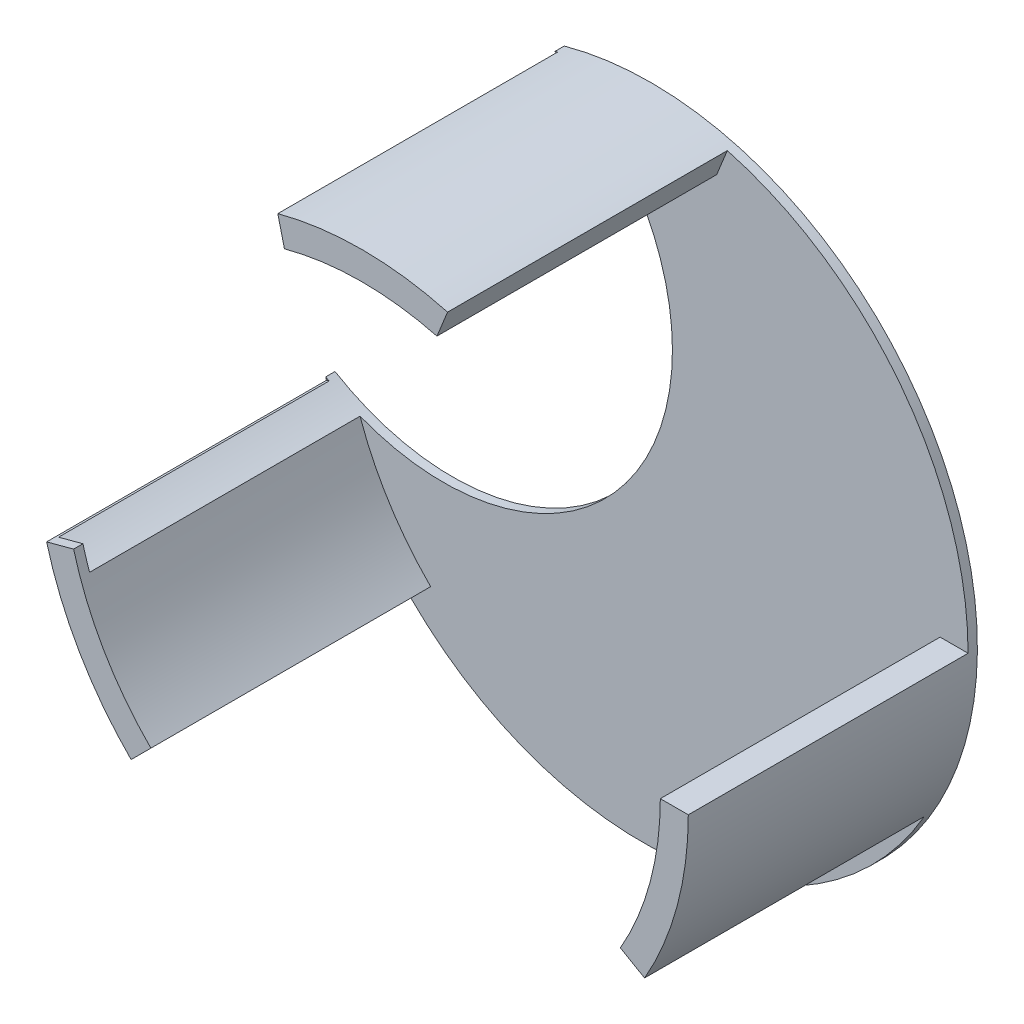
ISO-10303-21;
HEADER;
FILE_DESCRIPTION(('STEP AP214'),'2;1');
FILE_NAME('part.step','',(''),(''),'','','');
FILE_SCHEMA(('AUTOMOTIVE_DESIGN { 1 0 10303 214 1 1 1 1 }'));
ENDSEC;
DATA;
#1=APPLICATION_CONTEXT('core data for automotive mechanical design processes');
#2=APPLICATION_PROTOCOL_DEFINITION('international standard','automotive_design',2000,#1);
#3=PRODUCT_CONTEXT('',#1,'mechanical');
#4=PRODUCT('Part','Part','',(#3));
#5=PRODUCT_RELATED_PRODUCT_CATEGORY('part','',(#4));
#6=PRODUCT_DEFINITION_FORMATION('','',#4);
#7=PRODUCT_DEFINITION_CONTEXT('part definition',#1,'design');
#8=PRODUCT_DEFINITION('design','',#6,#7);
#9=PRODUCT_DEFINITION_SHAPE('','',#8);
#10=(LENGTH_UNIT() NAMED_UNIT(*) SI_UNIT(.MILLI.,.METRE.));
#11=(NAMED_UNIT(*) PLANE_ANGLE_UNIT() SI_UNIT($,.RADIAN.));
#12=(NAMED_UNIT(*) SI_UNIT($,.STERADIAN.) SOLID_ANGLE_UNIT());
#13=UNCERTAINTY_MEASURE_WITH_UNIT(LENGTH_MEASURE(1.E-05),#10,'distance_accuracy_value','');
#14=(GEOMETRIC_REPRESENTATION_CONTEXT(3) GLOBAL_UNCERTAINTY_ASSIGNED_CONTEXT((#13)) GLOBAL_UNIT_ASSIGNED_CONTEXT((#10,
#11,#12)) REPRESENTATION_CONTEXT('',''));
#15=CARTESIAN_POINT('',(0.,0.,0.));
#16=DIRECTION('',(0.,0.,1.));
#17=DIRECTION('',(1.,0.,0.));
#18=AXIS2_PLACEMENT_3D('',#15,#16,#17);
#19=CARTESIAN_POINT('',(0.,0.,0.5));
#20=DIRECTION('',(0.,0.,1.));
#21=DIRECTION('',(1.,0.,0.));
#22=AXIS2_PLACEMENT_3D('',#19,#20,#21);
#23=PLANE('',#22);
#24=CARTESIAN_POINT('',(-10.6304427894422,6.14635915775715,0.5));
#25=DIRECTION('',(0.,0.,1.));
#26=DIRECTION('',(1.,0.,0.));
#27=AXIS2_PLACEMENT_3D('',#24,#25,#26);
#28=CIRCLE('',#27,12.279415490802);
#29=CARTESIAN_POINT('',(-4.47445203521553,16.7712272806858,0.5));
#30=VERTEX_POINT('',#29);
#31=CARTESIAN_POINT('',(-4.64986435659355,16.8709442967867,0.5));
#32=VERTEX_POINT('',#31);
#33=EDGE_CURVE('E189',#30,#32,#28,.T.);
#34=ORIENTED_EDGE('',*,*,#33,.F.);
#35=DIRECTION('',(0.237212223602337,-0.971457853421153,0.));
#36=VECTOR('',#35,1.);
#37=CARTESIAN_POINT('',(-0.357886485286954,-0.0873893279807982,0.5));
#38=LINE('',#37,#36);
#39=CARTESIAN_POINT('',(-4.50818045766763,16.9093556636882,0.5));
#40=VERTEX_POINT('',#39);
#41=EDGE_CURVE('E188',#40,#30,#38,.T.);
#42=ORIENTED_EDGE('',*,*,#41,.F.);
#43=CARTESIAN_POINT('',(0.,0.,0.5));
#44=DIRECTION('',(0.,0.,1.));
#45=DIRECTION('',(1.,0.,0.));
#46=AXIS2_PLACEMENT_3D('',#43,#44,#45);
#47=CIRCLE('',#46,17.5);
#48=EDGE_CURVE('E292',#40,#32,#47,.T.);
#49=ORIENTED_EDGE('',*,*,#48,.T.);
#50=EDGE_LOOP('',(#34,#42,#49));
#51=FACE_BOUND('',#50,.T.);
#52=ADVANCED_FACE('F35',(#51),#23,.T.);
#53=CARTESIAN_POINT('',(-16.9411011111166,-4.38737884652367,0.5));
#54=VERTEX_POINT('',#53);
#55=CARTESIAN_POINT('',(-16.763496719694,-4.49176540836688,0.5));
#56=VERTEX_POINT('',#55);
#57=EDGE_CURVE('E194',#54,#56,#28,.T.);
#58=ORIENTED_EDGE('',*,*,#57,.F.);
#59=CARTESIAN_POINT('',(-16.9037019600579,-4.52933328929702,0.5));
#60=VERTEX_POINT('',#59);
#61=EDGE_CURVE('E39',#54,#60,#47,.T.);
#62=ORIENTED_EDGE('',*,*,#61,.T.);
#63=DIRECTION('',(0.965925826289024,0.258819045102686,0.));
#64=VECTOR('',#63,1.);
#65=CARTESIAN_POINT('',(-16.9037019600579,-4.52933328929702,0.5));
#66=LINE('',#65,#64);
#67=EDGE_CURVE('E218',#60,#56,#66,.T.);
#68=ORIENTED_EDGE('',*,*,#67,.T.);
#69=EDGE_LOOP('',(#58,#62,#68));
#70=FACE_BOUND('',#69,.T.);
#71=ADVANCED_FACE('F335',(#70),#23,.T.);
#72=CARTESIAN_POINT('',(-15.0999283417228,-5.29076214498786,0.5));
#73=VERTEX_POINT('',#72);
#74=CARTESIAN_POINT('',(-2.94873013869004,15.7263036015952,0.5));
#75=VERTEX_POINT('',#74);
#76=EDGE_CURVE('E174',#73,#75,#28,.T.);
#77=ORIENTED_EDGE('',*,*,#76,.F.);
#78=CARTESIAN_POINT('',(0.,0.,0.5));
#79=DIRECTION('',(0.,0.,1.));
#80=DIRECTION('',(1.,0.,0.));
#81=AXIS2_PLACEMENT_3D('',#78,#79,#80);
#82=CIRCLE('',#81,16.);
#83=CARTESIAN_POINT('',(-11.3137084989848,-11.3137084989847,0.5));
#84=VERTEX_POINT('',#83);
#85=EDGE_CURVE('E60',#73,#84,#82,.T.);
#86=ORIENTED_EDGE('',*,*,#85,.T.);
#87=DIRECTION('',(0.707106781186551,0.707106781186545,0.));
#88=VECTOR('',#87,1.);
#89=CARTESIAN_POINT('',(-12.3743686707647,-12.3743686707645,0.5));
#90=LINE('',#89,#88);
#91=CARTESIAN_POINT('',(-12.3743686707647,-12.3743686707645,0.5));
#92=VERTEX_POINT('',#91);
#93=EDGE_CURVE('E213',#92,#84,#90,.T.);
#94=ORIENTED_EDGE('',*,*,#93,.F.);
#95=CARTESIAN_POINT('',(15.1554445662277,-8.75000000000002,0.5));
#96=VERTEX_POINT('',#95);
#97=EDGE_CURVE('E296',#92,#96,#47,.T.);
#98=ORIENTED_EDGE('',*,*,#97,.T.);
#99=DIRECTION('',(0.866025403784432,-0.500000000000012,0.));
#100=VECTOR('',#99,1.);
#101=CARTESIAN_POINT('',(1.09721259855536E-13,1.90042796740249E-13,0.5));
#102=LINE('',#101,#100);
#103=CARTESIAN_POINT('',(13.856406460551,-8.,0.5));
#104=VERTEX_POINT('',#103);
#105=EDGE_CURVE('E269',#104,#96,#102,.T.);
#106=ORIENTED_EDGE('',*,*,#105,.F.);
#107=CARTESIAN_POINT('',(0.,0.,0.5));
#108=DIRECTION('',(0.,0.,1.));
#109=DIRECTION('',(1.,0.,0.));
#110=AXIS2_PLACEMENT_3D('',#107,#108,#109);
#111=CIRCLE('',#110,16.);
#112=CARTESIAN_POINT('',(16.,0.,0.5));
#113=VERTEX_POINT('',#112);
#114=EDGE_CURVE('E248',#104,#113,#111,.T.);
#115=ORIENTED_EDGE('',*,*,#114,.T.);
#116=DIRECTION('',(1.,0.,0.));
#117=VECTOR('',#116,1.);
#118=CARTESIAN_POINT('',(0.,0.,0.5));
#119=LINE('',#118,#117);
#120=CARTESIAN_POINT('',(17.5,0.,0.5));
#121=VERTEX_POINT('',#120);
#122=EDGE_CURVE('E260',#113,#121,#119,.T.);
#123=ORIENTED_EDGE('',*,*,#122,.T.);
#124=CARTESIAN_POINT('',(4.59298212333175,16.8865187417287,0.5));
#125=VERTEX_POINT('',#124);
#126=EDGE_CURVE('E295',#121,#125,#47,.T.);
#127=ORIENTED_EDGE('',*,*,#126,.T.);
#128=DIRECTION('',(0.376927889119517,0.926242606666258,0.));
#129=VECTOR('',#128,1.);
#130=CARTESIAN_POINT('',(-1.95509819432033,0.795613406361118,0.5));
#131=LINE('',#130,#129);
#132=CARTESIAN_POINT('',(4.02317567540056,15.4863065927686,0.5));
#133=VERTEX_POINT('',#132);
#134=EDGE_CURVE('E241',#133,#125,#131,.T.);
#135=ORIENTED_EDGE('',*,*,#134,.F.);
#136=CARTESIAN_POINT('',(0.,0.,0.5));
#137=DIRECTION('',(0.,0.,1.));
#138=DIRECTION('',(1.,0.,0.));
#139=AXIS2_PLACEMENT_3D('',#136,#137,#138);
#140=CIRCLE('',#139,16.0003635708806);
#141=EDGE_CURVE('E244',#75,#133,#140,.F.);
#142=ORIENTED_EDGE('',*,*,#141,.F.);
#143=EDGE_LOOP('',(#77,#86,#94,#98,#106,#115,#123,#127,#135,#142));
#144=FACE_BOUND('',#143,.T.);
#145=ADVANCED_FACE('F316',(#144),#23,.T.);
#146=CARTESIAN_POINT('',(0.,0.,0.5));
#147=DIRECTION('',(0.,0.,-1.));
#148=DIRECTION('',(-1.,0.,0.));
#149=AXIS2_PLACEMENT_3D('',#146,#147,#148);
#150=CYLINDRICAL_SURFACE('',#149,17.5);
#151=CARTESIAN_POINT('',(0.,0.,0.));
#152=DIRECTION('',(0.,0.,1.));
#153=DIRECTION('',(1.,0.,0.));
#154=AXIS2_PLACEMENT_3D('',#151,#152,#153);
#155=CIRCLE('',#154,17.5);
#156=CARTESIAN_POINT('',(-16.9411011111166,-4.38737884652367,0.));
#157=VERTEX_POINT('',#156);
#158=CARTESIAN_POINT('',(-4.64986435659355,16.8709442967867,0.));
#159=VERTEX_POINT('',#158);
#160=EDGE_CURVE('E298',#157,#159,#155,.T.);
#161=ORIENTED_EDGE('',*,*,#160,.T.);
#162=DIRECTION('',(0.,0.,-1.));
#163=VECTOR('',#162,1.);
#164=CARTESIAN_POINT('',(-4.64986435659355,16.8709442967867,7.5));
#165=LINE('',#164,#163);
#166=EDGE_CURVE('E192',#159,#32,#165,.F.);
#167=ORIENTED_EDGE('',*,*,#166,.T.);
#168=ORIENTED_EDGE('',*,*,#48,.F.);
#169=DIRECTION('',(0.,0.,-1.));
#170=VECTOR('',#169,1.);
#171=CARTESIAN_POINT('',(-4.50818045766763,16.9093556636882,15.5));
#172=LINE('',#171,#170);
#173=CARTESIAN_POINT('',(-4.50818045766763,16.9093556636882,15.5));
#174=VERTEX_POINT('',#173);
#175=EDGE_CURVE('E238',#174,#40,#172,.T.);
#176=ORIENTED_EDGE('',*,*,#175,.F.);
#177=CARTESIAN_POINT('',(0.,0.,15.5));
#178=DIRECTION('',(0.,0.,1.));
#179=DIRECTION('',(1.,0.,0.));
#180=AXIS2_PLACEMENT_3D('',#177,#178,#179);
#181=CIRCLE('',#180,17.5);
#182=CARTESIAN_POINT('',(4.59298212333175,16.8865187417287,15.5));
#183=VERTEX_POINT('',#182);
#184=EDGE_CURVE('E240',#183,#174,#181,.T.);
#185=ORIENTED_EDGE('',*,*,#184,.F.);
#186=DIRECTION('',(0.,0.,-1.));
#187=VECTOR('',#186,1.);
#188=CARTESIAN_POINT('',(4.59298212333175,16.8865187417287,15.5));
#189=LINE('',#188,#187);
#190=EDGE_CURVE('E235',#183,#125,#189,.T.);
#191=ORIENTED_EDGE('',*,*,#190,.T.);
#192=ORIENTED_EDGE('',*,*,#126,.F.);
#193=DIRECTION('',(0.,0.,-1.));
#194=VECTOR('',#193,1.);
#195=CARTESIAN_POINT('',(17.5,0.,15.5));
#196=LINE('',#195,#194);
#197=CARTESIAN_POINT('',(17.5,0.,15.5));
#198=VERTEX_POINT('',#197);
#199=EDGE_CURVE('E282',#198,#121,#196,.T.);
#200=ORIENTED_EDGE('',*,*,#199,.F.);
#201=CARTESIAN_POINT('',(0.,0.,15.5));
#202=DIRECTION('',(0.,0.,1.));
#203=DIRECTION('',(1.,0.,0.));
#204=AXIS2_PLACEMENT_3D('',#201,#202,#203);
#205=CIRCLE('',#204,17.5);
#206=CARTESIAN_POINT('',(15.1554445662277,-8.75000000000002,15.5));
#207=VERTEX_POINT('',#206);
#208=EDGE_CURVE('E262',#207,#198,#205,.T.);
#209=ORIENTED_EDGE('',*,*,#208,.F.);
#210=DIRECTION('',(0.,0.,-1.));
#211=VECTOR('',#210,1.);
#212=CARTESIAN_POINT('',(15.1554445662277,-8.75000000000002,15.5));
#213=LINE('',#212,#211);
#214=EDGE_CURVE('E278',#207,#96,#213,.T.);
#215=ORIENTED_EDGE('',*,*,#214,.T.);
#216=ORIENTED_EDGE('',*,*,#97,.F.);
#217=DIRECTION('',(0.,0.,-1.));
#218=VECTOR('',#217,1.);
#219=CARTESIAN_POINT('',(-12.3743686707647,-12.3743686707645,15.5));
#220=LINE('',#219,#218);
#221=CARTESIAN_POINT('',(-12.3743686707647,-12.3743686707645,15.5));
#222=VERTEX_POINT('',#221);
#223=EDGE_CURVE('E208',#222,#92,#220,.T.);
#224=ORIENTED_EDGE('',*,*,#223,.F.);
#225=CARTESIAN_POINT('',(0.,0.,15.5));
#226=DIRECTION('',(0.,0.,-1.));
#227=DIRECTION('',(-1.,0.,0.));
#228=AXIS2_PLACEMENT_3D('',#225,#226,#227);
#229=CIRCLE('',#228,17.5);
#230=CARTESIAN_POINT('',(-16.9037019600579,-4.52933328929703,15.5));
#231=VERTEX_POINT('',#230);
#232=EDGE_CURVE('E205',#222,#231,#229,.T.);
#233=ORIENTED_EDGE('',*,*,#232,.T.);
#234=DIRECTION('',(0.,0.,-1.));
#235=VECTOR('',#234,1.);
#236=CARTESIAN_POINT('',(-16.9037019600579,-4.52933328929703,15.5));
#237=LINE('',#236,#235);
#238=EDGE_CURVE('E201',#231,#60,#237,.T.);
#239=ORIENTED_EDGE('',*,*,#238,.T.);
#240=ORIENTED_EDGE('',*,*,#61,.F.);
#241=DIRECTION('',(0.,0.,-1.));
#242=VECTOR('',#241,1.);
#243=CARTESIAN_POINT('',(-16.9411011111166,-4.38737884652367,7.5));
#244=LINE('',#243,#242);
#245=EDGE_CURVE('E190',#54,#157,#244,.T.);
#246=ORIENTED_EDGE('',*,*,#245,.T.);
#247=EDGE_LOOP('',(#161,#167,#168,#176,#185,#191,#192,#200,#209,#215,#216,#224,#233,#239,#240,#246));
#248=FACE_BOUND('',#247,.T.);
#249=ADVANCED_FACE('F37',(#248),#150,.T.);
#250=CARTESIAN_POINT('',(0.,0.,0.));
#251=DIRECTION('',(0.,0.,1.));
#252=DIRECTION('',(1.,0.,0.));
#253=AXIS2_PLACEMENT_3D('',#250,#251,#252);
#254=PLANE('',#253);
#255=ORIENTED_EDGE('',*,*,#160,.F.);
#256=CARTESIAN_POINT('',(-10.6304427894422,6.14635915775715,0.));
#257=DIRECTION('',(0.,0.,-1.));
#258=DIRECTION('',(-1.,0.,0.));
#259=AXIS2_PLACEMENT_3D('',#256,#257,#258);
#260=CIRCLE('',#259,12.279415490802);
#261=EDGE_CURVE('E357',#159,#157,#260,.T.);
#262=ORIENTED_EDGE('',*,*,#261,.F.);
#263=EDGE_LOOP('',(#255,#262));
#264=FACE_BOUND('',#263,.T.);
#265=ADVANCED_FACE('F347',(#264),#254,.F.);
#266=CARTESIAN_POINT('',(0.,0.,15.5));
#267=DIRECTION('',(0.,0.,-1.));
#268=DIRECTION('',(-1.,0.,0.));
#269=AXIS2_PLACEMENT_3D('',#266,#267,#268);
#270=CYLINDRICAL_SURFACE('',#269,16.);
#271=ORIENTED_EDGE('',*,*,#114,.F.);
#272=DIRECTION('',(0.,0.,-1.));
#273=VECTOR('',#272,1.);
#274=CARTESIAN_POINT('',(13.856406460551,-8.,15.5));
#275=LINE('',#274,#273);
#276=CARTESIAN_POINT('',(13.856406460551,-8.,15.5));
#277=VERTEX_POINT('',#276);
#278=EDGE_CURVE('E281',#277,#104,#275,.T.);
#279=ORIENTED_EDGE('',*,*,#278,.F.);
#280=CARTESIAN_POINT('',(0.,0.,15.5));
#281=DIRECTION('',(0.,0.,1.));
#282=DIRECTION('',(1.,0.,0.));
#283=AXIS2_PLACEMENT_3D('',#280,#281,#282);
#284=CIRCLE('',#283,16.);
#285=CARTESIAN_POINT('',(16.,0.,15.5));
#286=VERTEX_POINT('',#285);
#287=EDGE_CURVE('E256',#277,#286,#284,.T.);
#288=ORIENTED_EDGE('',*,*,#287,.T.);
#289=DIRECTION('',(0.,0.,-1.));
#290=VECTOR('',#289,1.);
#291=CARTESIAN_POINT('',(16.,0.,15.5));
#292=LINE('',#291,#290);
#293=EDGE_CURVE('E267',#286,#113,#292,.T.);
#294=ORIENTED_EDGE('',*,*,#293,.T.);
#295=EDGE_LOOP('',(#271,#279,#288,#294));
#296=FACE_BOUND('',#295,.T.);
#297=ADVANCED_FACE('F314',(#296),#270,.F.);
#298=CARTESIAN_POINT('',(1.09721259855536E-13,1.90042796740249E-13,15.5));
#299=DIRECTION('',(0.500000000000012,0.866025403784432,0.));
#300=DIRECTION('',(-0.866025403784432,0.500000000000012,0.));
#301=AXIS2_PLACEMENT_3D('',#298,#299,#300);
#302=PLANE('',#301);
#303=ORIENTED_EDGE('',*,*,#105,.T.);
#304=ORIENTED_EDGE('',*,*,#214,.F.);
#305=DIRECTION('',(0.866025403784432,-0.500000000000012,0.));
#306=VECTOR('',#305,1.);
#307=CARTESIAN_POINT('',(1.09721259855536E-13,1.90042796740249E-13,15.5));
#308=LINE('',#307,#306);
#309=EDGE_CURVE('E259',#277,#207,#308,.T.);
#310=ORIENTED_EDGE('',*,*,#309,.F.);
#311=ORIENTED_EDGE('',*,*,#278,.T.);
#312=EDGE_LOOP('',(#303,#304,#310,#311));
#313=FACE_BOUND('',#312,.T.);
#314=ADVANCED_FACE('F309',(#313),#302,.F.);
#315=CARTESIAN_POINT('',(0.,0.,15.5));
#316=DIRECTION('',(0.,1.,0.));
#317=DIRECTION('',(-1.,0.,0.));
#318=AXIS2_PLACEMENT_3D('',#315,#316,#317);
#319=PLANE('',#318);
#320=ORIENTED_EDGE('',*,*,#122,.F.);
#321=ORIENTED_EDGE('',*,*,#293,.F.);
#322=DIRECTION('',(1.,0.,0.));
#323=VECTOR('',#322,1.);
#324=CARTESIAN_POINT('',(0.,0.,15.5));
#325=LINE('',#324,#323);
#326=EDGE_CURVE('E264',#286,#198,#325,.T.);
#327=ORIENTED_EDGE('',*,*,#326,.T.);
#328=ORIENTED_EDGE('',*,*,#199,.T.);
#329=EDGE_LOOP('',(#320,#321,#327,#328));
#330=FACE_BOUND('',#329,.T.);
#331=ADVANCED_FACE('F325',(#330),#319,.T.);
#332=CARTESIAN_POINT('',(0.,0.,15.5));
#333=DIRECTION('',(0.,0.,1.));
#334=DIRECTION('',(1.,0.,0.));
#335=AXIS2_PLACEMENT_3D('',#332,#333,#334);
#336=PLANE('',#335);
#337=ORIENTED_EDGE('',*,*,#287,.F.);
#338=ORIENTED_EDGE('',*,*,#309,.T.);
#339=ORIENTED_EDGE('',*,*,#208,.T.);
#340=ORIENTED_EDGE('',*,*,#326,.F.);
#341=EDGE_LOOP('',(#337,#338,#339,#340));
#342=FACE_BOUND('',#341,.T.);
#343=ADVANCED_FACE('F323',(#342),#336,.T.);
#344=CARTESIAN_POINT('',(-0.357886485286954,-0.0873893279807982,15.5));
#345=DIRECTION('',(0.971457853421153,0.237212223602337,0.));
#346=DIRECTION('',(-0.237212223602337,0.971457853421153,0.));
#347=AXIS2_PLACEMENT_3D('',#344,#345,#346);
#348=PLANE('',#347);
#349=ORIENTED_EDGE('',*,*,#41,.T.);
#350=DIRECTION('',(0.,0.,-1.));
#351=VECTOR('',#350,1.);
#352=CARTESIAN_POINT('',(-4.47445203521553,16.7712272806858,15.));
#353=LINE('',#352,#351);
#354=CARTESIAN_POINT('',(-4.47445203521553,16.7712272806858,15.));
#355=VERTEX_POINT('',#354);
#356=EDGE_CURVE('E178',#30,#355,#353,.F.);
#357=ORIENTED_EDGE('',*,*,#356,.T.);
#358=DIRECTION('',(-0.237212223602337,0.971457853421153,0.));
#359=VECTOR('',#358,1.);
#360=CARTESIAN_POINT('',(-0.357886485286954,-0.0873893279807982,15.));
#361=LINE('',#360,#359);
#362=CARTESIAN_POINT('',(-4.15236212226413,15.4521688835565,15.));
#363=VERTEX_POINT('',#362);
#364=EDGE_CURVE('E164',#363,#355,#361,.T.);
#365=ORIENTED_EDGE('',*,*,#364,.F.);
#366=DIRECTION('',(0.,0.,-1.));
#367=VECTOR('',#366,1.);
#368=CARTESIAN_POINT('',(-4.15236212226413,15.4521688835565,15.5));
#369=LINE('',#368,#367);
#370=CARTESIAN_POINT('',(-4.15236212226413,15.4521688835565,15.5));
#371=VERTEX_POINT('',#370);
#372=EDGE_CURVE('E221',#371,#363,#369,.T.);
#373=ORIENTED_EDGE('',*,*,#372,.F.);
#374=DIRECTION('',(0.237212223602337,-0.971457853421153,0.));
#375=VECTOR('',#374,1.);
#376=CARTESIAN_POINT('',(-0.357886485286954,-0.0873893279807982,15.5));
#377=LINE('',#376,#375);
#378=EDGE_CURVE('E245',#174,#371,#377,.T.);
#379=ORIENTED_EDGE('',*,*,#378,.F.);
#380=ORIENTED_EDGE('',*,*,#175,.T.);
#381=EDGE_LOOP('',(#349,#357,#365,#373,#379,#380));
#382=FACE_BOUND('',#381,.T.);
#383=ADVANCED_FACE('F185',(#382),#348,.F.);
#384=CARTESIAN_POINT('',(0.,0.,15.5));
#385=DIRECTION('',(0.,0.,-1.));
#386=DIRECTION('',(-1.,0.,0.));
#387=AXIS2_PLACEMENT_3D('',#384,#385,#386);
#388=CYLINDRICAL_SURFACE('',#387,16.0003635708806);
#389=CARTESIAN_POINT('',(0.,0.,15.));
#390=DIRECTION('',(0.,0.,-1.));
#391=DIRECTION('',(-1.,0.,0.));
#392=AXIS2_PLACEMENT_3D('',#389,#390,#391);
#393=CIRCLE('',#392,16.0003635708806);
#394=CARTESIAN_POINT('',(-2.94873013869004,15.7263036015952,15.));
#395=VERTEX_POINT('',#394);
#396=EDGE_CURVE('E169',#395,#363,#393,.F.);
#397=ORIENTED_EDGE('',*,*,#396,.F.);
#398=DIRECTION('',(0.,0.,-1.));
#399=VECTOR('',#398,1.);
#400=CARTESIAN_POINT('',(-2.94873013869004,15.7263036015952,7.5));
#401=LINE('',#400,#399);
#402=EDGE_CURVE('E181',#395,#75,#401,.T.);
#403=ORIENTED_EDGE('',*,*,#402,.T.);
#404=ORIENTED_EDGE('',*,*,#141,.T.);
#405=DIRECTION('',(0.,0.,-1.));
#406=VECTOR('',#405,1.);
#407=CARTESIAN_POINT('',(4.02317567540056,15.4863065927686,15.5));
#408=LINE('',#407,#406);
#409=CARTESIAN_POINT('',(4.02317567540056,15.4863065927686,15.5));
#410=VERTEX_POINT('',#409);
#411=EDGE_CURVE('E232',#410,#133,#408,.T.);
#412=ORIENTED_EDGE('',*,*,#411,.F.);
#413=CARTESIAN_POINT('',(0.,0.,15.5));
#414=DIRECTION('',(0.,0.,1.));
#415=DIRECTION('',(1.,0.,0.));
#416=AXIS2_PLACEMENT_3D('',#413,#414,#415);
#417=CIRCLE('',#416,16.0003635708806);
#418=EDGE_CURVE('E252',#371,#410,#417,.F.);
#419=ORIENTED_EDGE('',*,*,#418,.F.);
#420=ORIENTED_EDGE('',*,*,#372,.T.);
#421=EDGE_LOOP('',(#397,#403,#404,#412,#419,#420));
#422=FACE_BOUND('',#421,.T.);
#423=ADVANCED_FACE('F366',(#422),#388,.F.);
#424=CARTESIAN_POINT('',(-1.95509819432033,0.795613406361118,15.5));
#425=DIRECTION('',(-0.926242606666258,0.376927889119517,0.));
#426=DIRECTION('',(-0.376927889119517,-0.926242606666258,0.));
#427=AXIS2_PLACEMENT_3D('',#424,#425,#426);
#428=PLANE('',#427);
#429=ORIENTED_EDGE('',*,*,#134,.T.);
#430=ORIENTED_EDGE('',*,*,#190,.F.);
#431=DIRECTION('',(0.376927889119517,0.926242606666258,0.));
#432=VECTOR('',#431,1.);
#433=CARTESIAN_POINT('',(-1.95509819432033,0.795613406361118,15.5));
#434=LINE('',#433,#432);
#435=EDGE_CURVE('E250',#410,#183,#434,.T.);
#436=ORIENTED_EDGE('',*,*,#435,.F.);
#437=ORIENTED_EDGE('',*,*,#411,.T.);
#438=EDGE_LOOP('',(#429,#430,#436,#437));
#439=FACE_BOUND('',#438,.T.);
#440=ADVANCED_FACE('F371',(#439),#428,.F.);
#441=CARTESIAN_POINT('',(0.,0.,15.5));
#442=DIRECTION('',(0.,0.,1.));
#443=DIRECTION('',(1.,0.,0.));
#444=AXIS2_PLACEMENT_3D('',#441,#442,#443);
#445=PLANE('',#444);
#446=ORIENTED_EDGE('',*,*,#378,.T.);
#447=ORIENTED_EDGE('',*,*,#418,.T.);
#448=ORIENTED_EDGE('',*,*,#435,.T.);
#449=ORIENTED_EDGE('',*,*,#184,.T.);
#450=EDGE_LOOP('',(#446,#447,#448,#449));
#451=FACE_BOUND('',#450,.T.);
#452=ADVANCED_FACE('F374',(#451),#445,.T.);
#453=CARTESIAN_POINT('',(-16.9037019600579,-4.52933328929702,15.5));
#454=DIRECTION('',(-0.258819045102686,0.965925826289024,0.));
#455=DIRECTION('',(-0.965925826289024,-0.258819045102686,0.));
#456=AXIS2_PLACEMENT_3D('',#453,#454,#455);
#457=PLANE('',#456);
#458=DIRECTION('',(0.,0.,-1.));
#459=VECTOR('',#458,1.);
#460=CARTESIAN_POINT('',(-16.763496719694,-4.49176540836688,15.));
#461=LINE('',#460,#459);
#462=CARTESIAN_POINT('',(-16.763496719694,-4.49176540836688,15.));
#463=VERTEX_POINT('',#462);
#464=EDGE_CURVE('E362',#56,#463,#461,.F.);
#465=ORIENTED_EDGE('',*,*,#464,.F.);
#466=ORIENTED_EDGE('',*,*,#67,.F.);
#467=ORIENTED_EDGE('',*,*,#238,.F.);
#468=DIRECTION('',(0.965925826289024,0.258819045102686,0.));
#469=VECTOR('',#468,1.);
#470=CARTESIAN_POINT('',(-16.9037019600579,-4.52933328929702,15.5));
#471=LINE('',#470,#469);
#472=CARTESIAN_POINT('',(-15.4548132206244,-4.14110472164299,15.5));
#473=VERTEX_POINT('',#472);
#474=EDGE_CURVE('E216',#231,#473,#471,.T.);
#475=ORIENTED_EDGE('',*,*,#474,.T.);
#476=DIRECTION('',(0.,0.,-1.));
#477=VECTOR('',#476,1.);
#478=CARTESIAN_POINT('',(-15.4548132206244,-4.14110472164299,15.5));
#479=LINE('',#478,#477);
#480=CARTESIAN_POINT('',(-15.4548132206244,-4.14110472164299,15.));
#481=VERTEX_POINT('',#480);
#482=EDGE_CURVE('E202',#473,#481,#479,.T.);
#483=ORIENTED_EDGE('',*,*,#482,.T.);
#484=DIRECTION('',(-0.965925826289024,-0.258819045102686,0.));
#485=VECTOR('',#484,1.);
#486=CARTESIAN_POINT('',(-16.9037019600579,-4.52933328929702,15.));
#487=LINE('',#486,#485);
#488=EDGE_CURVE('E52',#481,#463,#487,.T.);
#489=ORIENTED_EDGE('',*,*,#488,.T.);
#490=EDGE_LOOP('',(#465,#466,#467,#475,#483,#489));
#491=FACE_BOUND('',#490,.T.);
#492=ADVANCED_FACE('F378',(#491),#457,.T.);
#493=CARTESIAN_POINT('',(-12.3743686707647,-12.3743686707645,15.5));
#494=DIRECTION('',(-0.707106781186545,0.70710678118655,0.));
#495=DIRECTION('',(-0.70710678118655,-0.707106781186545,0.));
#496=AXIS2_PLACEMENT_3D('',#493,#494,#495);
#497=PLANE('',#496);
#498=ORIENTED_EDGE('',*,*,#93,.T.);
#499=DIRECTION('',(0.,0.,-1.));
#500=VECTOR('',#499,1.);
#501=CARTESIAN_POINT('',(-11.3137084989848,-11.3137084989847,15.5));
#502=LINE('',#501,#500);
#503=CARTESIAN_POINT('',(-11.3137084989848,-11.3137084989847,15.5));
#504=VERTEX_POINT('',#503);
#505=EDGE_CURVE('E206',#504,#84,#502,.T.);
#506=ORIENTED_EDGE('',*,*,#505,.F.);
#507=DIRECTION('',(0.707106781186551,0.707106781186545,0.));
#508=VECTOR('',#507,1.);
#509=CARTESIAN_POINT('',(-12.3743686707647,-12.3743686707645,15.5));
#510=LINE('',#509,#508);
#511=EDGE_CURVE('E224',#222,#504,#510,.T.);
#512=ORIENTED_EDGE('',*,*,#511,.F.);
#513=ORIENTED_EDGE('',*,*,#223,.T.);
#514=EDGE_LOOP('',(#498,#506,#512,#513));
#515=FACE_BOUND('',#514,.T.);
#516=ADVANCED_FACE('F384',(#515),#497,.F.);
#517=CARTESIAN_POINT('',(0.,0.,15.5));
#518=DIRECTION('',(0.,0.,-1.));
#519=DIRECTION('',(-1.,0.,0.));
#520=AXIS2_PLACEMENT_3D('',#517,#518,#519);
#521=CYLINDRICAL_SURFACE('',#520,16.);
#522=DIRECTION('',(0.,0.,-1.));
#523=VECTOR('',#522,1.);
#524=CARTESIAN_POINT('',(-15.0999283417228,-5.29076214498786,7.5));
#525=LINE('',#524,#523);
#526=CARTESIAN_POINT('',(-15.0999283417228,-5.29076214498786,15.));
#527=VERTEX_POINT('',#526);
#528=EDGE_CURVE('E11',#527,#73,#525,.T.);
#529=ORIENTED_EDGE('',*,*,#528,.F.);
#530=CARTESIAN_POINT('',(0.,0.,15.));
#531=DIRECTION('',(0.,0.,-1.));
#532=DIRECTION('',(-1.,0.,0.));
#533=AXIS2_PLACEMENT_3D('',#530,#531,#532);
#534=CIRCLE('',#533,16.);
#535=EDGE_CURVE('E45',#527,#481,#534,.T.);
#536=ORIENTED_EDGE('',*,*,#535,.T.);
#537=ORIENTED_EDGE('',*,*,#482,.F.);
#538=CARTESIAN_POINT('',(0.,0.,15.5));
#539=DIRECTION('',(0.,0.,1.));
#540=DIRECTION('',(1.,0.,0.));
#541=AXIS2_PLACEMENT_3D('',#538,#539,#540);
#542=CIRCLE('',#541,16.);
#543=EDGE_CURVE('E226',#473,#504,#542,.T.);
#544=ORIENTED_EDGE('',*,*,#543,.T.);
#545=ORIENTED_EDGE('',*,*,#505,.T.);
#546=ORIENTED_EDGE('',*,*,#85,.F.);
#547=EDGE_LOOP('',(#529,#536,#537,#544,#545,#546));
#548=FACE_BOUND('',#547,.T.);
#549=ADVANCED_FACE('F396',(#548),#521,.F.);
#550=CARTESIAN_POINT('',(0.,0.,15.5));
#551=DIRECTION('',(0.,0.,1.));
#552=DIRECTION('',(1.,0.,0.));
#553=AXIS2_PLACEMENT_3D('',#550,#551,#552);
#554=PLANE('',#553);
#555=ORIENTED_EDGE('',*,*,#474,.F.);
#556=ORIENTED_EDGE('',*,*,#232,.F.);
#557=ORIENTED_EDGE('',*,*,#511,.T.);
#558=ORIENTED_EDGE('',*,*,#543,.F.);
#559=EDGE_LOOP('',(#555,#556,#557,#558));
#560=FACE_BOUND('',#559,.T.);
#561=ADVANCED_FACE('F393',(#560),#554,.T.);
#562=CARTESIAN_POINT('',(-10.6304427894422,6.14635915775715,15.));
#563=DIRECTION('',(0.,0.,-1.));
#564=DIRECTION('',(-1.,0.,0.));
#565=AXIS2_PLACEMENT_3D('',#562,#563,#564);
#566=CYLINDRICAL_SURFACE('',#565,12.279415490802);
#567=ORIENTED_EDGE('',*,*,#261,.T.);
#568=ORIENTED_EDGE('',*,*,#245,.F.);
#569=ORIENTED_EDGE('',*,*,#57,.T.);
#570=ORIENTED_EDGE('',*,*,#464,.T.);
#571=CARTESIAN_POINT('',(-10.6304427894422,6.14635915775715,15.));
#572=DIRECTION('',(0.,0.,-1.));
#573=DIRECTION('',(-1.,0.,0.));
#574=AXIS2_PLACEMENT_3D('',#571,#572,#573);
#575=CIRCLE('',#574,12.279415490802);
#576=EDGE_CURVE('E182',#527,#463,#575,.T.);
#577=ORIENTED_EDGE('',*,*,#576,.F.);
#578=ORIENTED_EDGE('',*,*,#528,.T.);
#579=ORIENTED_EDGE('',*,*,#76,.T.);
#580=ORIENTED_EDGE('',*,*,#402,.F.);
#581=EDGE_CURVE('E167',#355,#395,#575,.T.);
#582=ORIENTED_EDGE('',*,*,#581,.F.);
#583=ORIENTED_EDGE('',*,*,#356,.F.);
#584=ORIENTED_EDGE('',*,*,#33,.T.);
#585=ORIENTED_EDGE('',*,*,#166,.F.);
#586=EDGE_LOOP('',(#567,#568,#569,#570,#577,#578,#579,#580,#582,#583,#584,#585));
#587=FACE_BOUND('',#586,.T.);
#588=ADVANCED_FACE('F177',(#587),#566,.F.);
#589=CARTESIAN_POINT('',(-10.6304427894422,6.14635915775715,15.));
#590=DIRECTION('',(0.,0.,-1.));
#591=DIRECTION('',(-1.,0.,0.));
#592=AXIS2_PLACEMENT_3D('',#589,#590,#591);
#593=PLANE('',#592);
#594=ORIENTED_EDGE('',*,*,#364,.T.);
#595=ORIENTED_EDGE('',*,*,#581,.T.);
#596=ORIENTED_EDGE('',*,*,#396,.T.);
#597=EDGE_LOOP('',(#594,#595,#596));
#598=FACE_BOUND('',#597,.T.);
#599=ADVANCED_FACE('F166',(#598),#593,.T.);
#600=ORIENTED_EDGE('',*,*,#535,.F.);
#601=ORIENTED_EDGE('',*,*,#576,.T.);
#602=ORIENTED_EDGE('',*,*,#488,.F.);
#603=EDGE_LOOP('',(#600,#601,#602));
#604=FACE_BOUND('',#603,.T.);
#605=ADVANCED_FACE('F405',(#604),#593,.T.);
#606=CLOSED_SHELL('',(#52,#71,#145,#249,#265,#297,#314,#331,#343,#383,#423,#440,#452,#492,#516,
#549,#561,#588,#599,#605));
#607=MANIFOLD_SOLID_BREP('B2',#606);
#608=ADVANCED_BREP_SHAPE_REPRESENTATION('',(#18,#607),#14);
#609=SHAPE_DEFINITION_REPRESENTATION(#9,#608);
ENDSEC;
END-ISO-10303-21;
